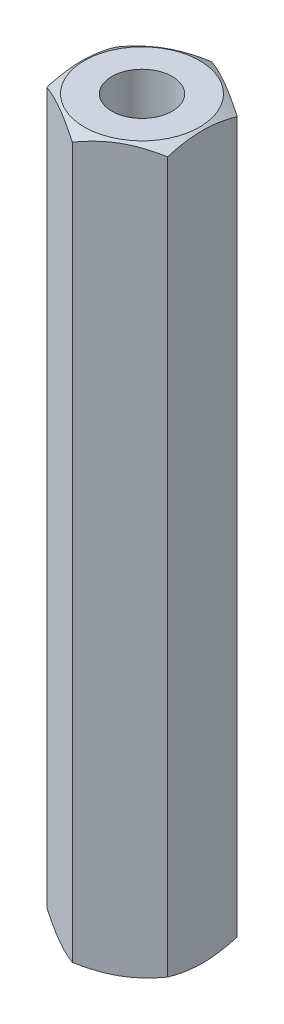
ISO-10303-21;
HEADER;
FILE_DESCRIPTION(('STEP AP214'),'2;1');
FILE_NAME('part.step','',(''),(''),'','','');
FILE_SCHEMA(('AUTOMOTIVE_DESIGN { 1 0 10303 214 1 1 1 1 }'));
ENDSEC;
DATA;
#1=APPLICATION_CONTEXT('core data for automotive mechanical design processes');
#2=APPLICATION_PROTOCOL_DEFINITION('international standard','automotive_design',2000,#1);
#3=PRODUCT_CONTEXT('',#1,'mechanical');
#4=PRODUCT('Part','Part','',(#3));
#5=PRODUCT_RELATED_PRODUCT_CATEGORY('part','',(#4));
#6=PRODUCT_DEFINITION_FORMATION('','',#4);
#7=PRODUCT_DEFINITION_CONTEXT('part definition',#1,'design');
#8=PRODUCT_DEFINITION('design','',#6,#7);
#9=PRODUCT_DEFINITION_SHAPE('','',#8);
#10=(LENGTH_UNIT() NAMED_UNIT(*) SI_UNIT(.MILLI.,.METRE.));
#11=(NAMED_UNIT(*) PLANE_ANGLE_UNIT() SI_UNIT($,.RADIAN.));
#12=(NAMED_UNIT(*) SI_UNIT($,.STERADIAN.) SOLID_ANGLE_UNIT());
#13=UNCERTAINTY_MEASURE_WITH_UNIT(LENGTH_MEASURE(1.E-05),#10,'distance_accuracy_value','');
#14=(GEOMETRIC_REPRESENTATION_CONTEXT(3) GLOBAL_UNCERTAINTY_ASSIGNED_CONTEXT((#13)) GLOBAL_UNIT_ASSIGNED_CONTEXT((#10,
#11,#12)) REPRESENTATION_CONTEXT('',''));
#15=CARTESIAN_POINT('',(0.,0.,0.));
#16=DIRECTION('',(0.,0.,1.));
#17=DIRECTION('',(1.,0.,0.));
#18=AXIS2_PLACEMENT_3D('',#15,#16,#17);
#19=CARTESIAN_POINT('',(2.5,30.,-1.44337567297406));
#20=DIRECTION('',(-0.500000000000001,0.,0.866025403784438));
#21=DIRECTION('',(0.866025403784438,0.,0.500000000000001));
#22=AXIS2_PLACEMENT_3D('',#19,#20,#21);
#23=PLANE('',#22);
#24=DIRECTION('',(0.,-1.,0.));
#25=VECTOR('',#24,1.);
#26=CARTESIAN_POINT('',(2.5,30.,-1.44337567297406));
#27=LINE('',#26,#25);
#28=CARTESIAN_POINT('',(2.5,29.7113248654054,-1.44337567297443));
#29=VERTEX_POINT('',#28);
#30=CARTESIAN_POINT('',(2.5,0.288675134594814,-1.44337567297406));
#31=VERTEX_POINT('',#30);
#32=EDGE_CURVE('E109',#29,#31,#27,.T.);
#33=ORIENTED_EDGE('',*,*,#32,.T.);
#34=CARTESIAN_POINT('',(2.5002,0.288741805261321,-1.44326020292022));
#35=CARTESIAN_POINT('',(2.39033676526513,0.252105761009838,-1.50668977106844));
#36=CARTESIAN_POINT('',(2.27952520010348,0.218786359867268,-1.57066685804385));
#37=CARTESIAN_POINT('',(2.05598316653395,0.160626426460069,-1.69972891130041));
#38=CARTESIAN_POINT('',(1.94324872547161,0.135806470049949,-1.76481617119469));
#39=CARTESIAN_POINT('',(1.71917700612473,0.0971697923432615,-1.8941840386774));
#40=CARTESIAN_POINT('',(1.60787420823263,0.0830959370878483,-1.95844473900196));
#41=CARTESIAN_POINT('',(1.38474477253167,0.0662932932549594,-2.08726857876804));
#42=CARTESIAN_POINT('',(1.27291894598578,0.0635505921058358,-2.15183124982666));
#43=CARTESIAN_POINT('',(1.06395802444848,0.0692499009102628,-2.27247489412633));
#44=CARTESIAN_POINT('',(0.96679168244227,0.076292535284071,-2.32857390783979));
#45=CARTESIAN_POINT('',(0.773092050288998,0.0986155600271525,-2.44040644260542));
#46=CARTESIAN_POINT('',(0.676559430340268,0.113903579342478,-2.49613957671839));
#47=CARTESIAN_POINT('',(0.482460278259523,0.152123234746632,-2.60820277442169));
#48=CARTESIAN_POINT('',(0.384918318217858,0.175216917027729,-2.66451865130903));
#49=CARTESIAN_POINT('',(0.191289391923913,0.227630797480126,-2.77631036402774));
#50=CARTESIAN_POINT('',(0.0951999441138212,0.256938676526762,-2.83178763258718));
#51=CARTESIAN_POINT('',(-0.000200000000003351,0.288741805261323,-2.88686681600197));
#52=B_SPLINE_CURVE_WITH_KNOTS('',3,(#34,#35,#36,#37,#38,#39,#40,#41,#42,#43,#44,#45,#46,#47,#48,
#49,#50,#51),.UNSPECIFIED.,.F.,.F.,(4,2,2,2,2,2,2,2,4),(0.,0.396285827362227,0.793524330152052,
1.18093086852114,1.56786160134476,1.90479741793733,2.24204551660463,2.58677531536757,
2.93082800105257),.UNSPECIFIED.);
#53=CARTESIAN_POINT('',(0.,0.288675134594816,-2.88675134594813));
#54=VERTEX_POINT('',#53);
#55=EDGE_CURVE('E53',#31,#54,#52,.T.);
#56=ORIENTED_EDGE('',*,*,#55,.T.);
#57=DIRECTION('',(0.,-1.,0.));
#58=VECTOR('',#57,1.);
#59=CARTESIAN_POINT('',(0.,30.,-2.88675134594813));
#60=LINE('',#59,#58);
#61=CARTESIAN_POINT('',(0.,29.7113248654052,-2.88675134594813));
#62=VERTEX_POINT('',#61);
#63=EDGE_CURVE('E11',#62,#54,#60,.T.);
#64=ORIENTED_EDGE('',*,*,#63,.F.);
#65=CARTESIAN_POINT('',(-0.000200000000003254,29.7112581947387,-2.88686681600197));
#66=CARTESIAN_POINT('',(0.109663234734867,29.7478942389902,-2.82343724785375));
#67=CARTESIAN_POINT('',(0.220474799896522,29.7812136401327,-2.75946016087834));
#68=CARTESIAN_POINT('',(0.444016833466046,29.8393735735399,-2.63039810762178));
#69=CARTESIAN_POINT('',(0.556751274528386,29.8641935299501,-2.5653108477275));
#70=CARTESIAN_POINT('',(0.780822993875267,29.9028302076567,-2.43594298024479));
#71=CARTESIAN_POINT('',(0.892125791767375,29.9169040629122,-2.37168227992023));
#72=CARTESIAN_POINT('',(1.11525522746833,29.933706706745,-2.24285844015415));
#73=CARTESIAN_POINT('',(1.22708105401423,29.9364494078942,-2.17829576909552));
#74=CARTESIAN_POINT('',(1.43604197555152,29.9307500990897,-2.05765212479585));
#75=CARTESIAN_POINT('',(1.53320831755773,29.9237074647159,-2.0015531110824));
#76=CARTESIAN_POINT('',(1.726907949711,29.9013844399728,-1.88972057631677));
#77=CARTESIAN_POINT('',(1.82344056965973,29.8860964206575,-1.83398744220379));
#78=CARTESIAN_POINT('',(2.01753972174048,29.8478767652534,-1.7219242445005));
#79=CARTESIAN_POINT('',(2.11508168178214,29.8247830829723,-1.66560836761316));
#80=CARTESIAN_POINT('',(2.30871060807609,29.7723692025199,-1.55381665489445));
#81=CARTESIAN_POINT('',(2.40480005588618,29.7430613234732,-1.49833938633501));
#82=CARTESIAN_POINT('',(2.5002,29.7112581947387,-1.44326020292022));
#83=B_SPLINE_CURVE_WITH_KNOTS('',3,(#65,#66,#67,#68,#69,#70,#71,#72,#73,#74,#75,#76,#77,#78,#79,
#80,#81,#82),.UNSPECIFIED.,.F.,.F.,(4,2,2,2,2,2,2,2,4),(0.,0.396285827362227,0.793524330152054,
1.18093086852114,1.56786160134476,1.90479741793734,2.24204551660464,2.58677531536757,
2.93082800105258),.UNSPECIFIED.);
#84=EDGE_CURVE('E211',#62,#29,#83,.T.);
#85=ORIENTED_EDGE('',*,*,#84,.T.);
#86=EDGE_LOOP('',(#33,#56,#64,#85));
#87=FACE_BOUND('',#86,.T.);
#88=ADVANCED_FACE('F36',(#87),#23,.F.);
#89=CARTESIAN_POINT('',(0.,30.,-2.88675134594813));
#90=DIRECTION('',(0.5,0.,0.866025403784438));
#91=DIRECTION('',(0.866025403784439,0.,-0.5));
#92=AXIS2_PLACEMENT_3D('',#89,#90,#91);
#93=PLANE('',#92);
#94=ORIENTED_EDGE('',*,*,#63,.T.);
#95=CARTESIAN_POINT('',(0.000199999999996824,0.288741805261323,-2.88686681600197));
#96=CARTESIAN_POINT('',(-0.109663234734875,0.25210576100984,-2.82343724785375));
#97=CARTESIAN_POINT('',(-0.220474799896529,0.21878635986727,-2.75946016087834));
#98=CARTESIAN_POINT('',(-0.444016833466054,0.160626426460071,-2.63039810762178));
#99=CARTESIAN_POINT('',(-0.556751274528393,0.135806470049951,-2.5653108477275));
#100=CARTESIAN_POINT('',(-0.780822993875274,0.0971697923432641,-2.43594298024479));
#101=CARTESIAN_POINT('',(-0.892125791767383,0.0830959370878512,-2.37168227992023));
#102=CARTESIAN_POINT('',(-1.11525522746834,0.0662932932549624,-2.24285844015415));
#103=CARTESIAN_POINT('',(-1.22708105401423,0.0635505921058387,-2.17829576909553));
#104=CARTESIAN_POINT('',(-1.43604197555153,0.0692499009102658,-2.05765212479586));
#105=CARTESIAN_POINT('',(-1.53320831755774,0.0762925352840742,-2.0015531110824));
#106=CARTESIAN_POINT('',(-1.72690794971101,0.0986155600271554,-1.88972057631678));
#107=CARTESIAN_POINT('',(-1.82344056965974,0.11390357934248,-1.8339874422038));
#108=CARTESIAN_POINT('',(-2.01753972174048,0.152123234746634,-1.7219242445005));
#109=CARTESIAN_POINT('',(-2.11508168178214,0.17521691702773,-1.66560836761317));
#110=CARTESIAN_POINT('',(-2.30871060807609,0.227630797480127,-1.55381665489446));
#111=CARTESIAN_POINT('',(-2.40480005588618,0.256938676526762,-1.49833938633502));
#112=CARTESIAN_POINT('',(-2.5002,0.288741805261322,-1.44326020292023));
#113=B_SPLINE_CURVE_WITH_KNOTS('',3,(#95,#96,#97,#98,#99,#100,#101,#102,#103,#104,#105,#106,
#107,#108,#109,#110,#111,#112),.UNSPECIFIED.,.F.,.F.,(4,2,2,2,2,2,2,2,4),(0.,0.396285827362228,
0.793524330152054,1.18093086852114,1.56786160134476,1.90479741793733,2.24204551660463,
2.58677531536756,2.93082800105256),.UNSPECIFIED.);
#114=CARTESIAN_POINT('',(-2.5,0.288675134594564,-1.44337567297444));
#115=VERTEX_POINT('',#114);
#116=EDGE_CURVE('E125',#54,#115,#113,.T.);
#117=ORIENTED_EDGE('',*,*,#116,.T.);
#118=DIRECTION('',(0.,-1.,0.));
#119=VECTOR('',#118,1.);
#120=CARTESIAN_POINT('',(-2.5,30.,-1.44337567297407));
#121=LINE('',#120,#119);
#122=CARTESIAN_POINT('',(-2.5,29.7113248654054,-1.44337567297444));
#123=VERTEX_POINT('',#122);
#124=EDGE_CURVE('E45',#123,#115,#121,.T.);
#125=ORIENTED_EDGE('',*,*,#124,.F.);
#126=CARTESIAN_POINT('',(-2.5002,29.7112581947387,-1.44326020292023));
#127=CARTESIAN_POINT('',(-2.39033676526513,29.7478942389902,-1.50668977106845));
#128=CARTESIAN_POINT('',(-2.27952520010347,29.7812136401327,-1.57066685804386));
#129=CARTESIAN_POINT('',(-2.05598316653395,29.8393735735399,-1.69972891130042));
#130=CARTESIAN_POINT('',(-1.94324872547161,29.8641935299501,-1.7648161711947));
#131=CARTESIAN_POINT('',(-1.71917700612473,29.9028302076567,-1.89418403867741));
#132=CARTESIAN_POINT('',(-1.60787420823262,29.9169040629121,-1.95844473900197));
#133=CARTESIAN_POINT('',(-1.38474477253166,29.933706706745,-2.08726857876805));
#134=CARTESIAN_POINT('',(-1.27291894598577,29.9364494078942,-2.15183124982667));
#135=CARTESIAN_POINT('',(-1.06395802444848,29.9307500990897,-2.27247489412634));
#136=CARTESIAN_POINT('',(-0.966791682442266,29.9237074647159,-2.3285739078398));
#137=CARTESIAN_POINT('',(-0.773092050288995,29.9013844399728,-2.44040644260542));
#138=CARTESIAN_POINT('',(-0.676559430340266,29.8860964206575,-2.4961395767184));
#139=CARTESIAN_POINT('',(-0.482460278259523,29.8478767652534,-2.6082027744217));
#140=CARTESIAN_POINT('',(-0.384918318217859,29.8247830829723,-2.66451865130903));
#141=CARTESIAN_POINT('',(-0.191289391923916,29.7723692025199,-2.77631036402774));
#142=CARTESIAN_POINT('',(-0.0951999441138265,29.7430613234732,-2.83178763258718));
#143=CARTESIAN_POINT('',(0.000199999999996853,29.7112581947387,-2.88686681600197));
#144=B_SPLINE_CURVE_WITH_KNOTS('',3,(#126,#127,#128,#129,#130,#131,#132,#133,#134,#135,#136,
#137,#138,#139,#140,#141,#142,#143),.UNSPECIFIED.,.F.,.F.,(4,2,2,2,2,2,2,2,4),(0.,
0.396285827362228,0.793524330152053,1.18093086852114,1.56786160134476,1.90479741793733,
2.24204551660463,2.58677531536756,2.93082800105256),.UNSPECIFIED.);
#145=EDGE_CURVE('E199',#123,#62,#144,.T.);
#146=ORIENTED_EDGE('',*,*,#145,.T.);
#147=EDGE_LOOP('',(#94,#117,#125,#146));
#148=FACE_BOUND('',#147,.T.);
#149=ADVANCED_FACE('F185',(#148),#93,.F.);
#150=CARTESIAN_POINT('',(-2.5,30.,-1.44337567297407));
#151=DIRECTION('',(1.,0.,0.));
#152=DIRECTION('',(0.,0.,-1.));
#153=AXIS2_PLACEMENT_3D('',#150,#151,#152);
#154=PLANE('',#153);
#155=ORIENTED_EDGE('',*,*,#124,.T.);
#156=CARTESIAN_POINT('',(-2.5,1.28663298822599,-3.8795194937669));
#157=CARTESIAN_POINT('',(-2.5,1.2336451613314,-3.7703066153545));
#158=CARTESIAN_POINT('',(-2.5,1.18116470176831,-3.66084329012373));
#159=CARTESIAN_POINT('',(-2.5,1.07750382370916,-3.44128256896489));
#160=CARTESIAN_POINT('',(-2.5,1.02632360962839,-3.33118507663453));
#161=CARTESIAN_POINT('',(-2.5,0.925291572765471,-3.10965677499139));
#162=CARTESIAN_POINT('',(-2.5,0.875448477413951,-2.99822197160029));
#163=CARTESIAN_POINT('',(-2.5,0.777798803442547,-2.77446689113107));
#164=CARTESIAN_POINT('',(-2.5,0.729992128763003,-2.66214665611635));
#165=CARTESIAN_POINT('',(-2.5,0.635455320843376,-2.43280919865732));
#166=CARTESIAN_POINT('',(-2.5,0.588809295603019,-2.31575711540437));
#167=CARTESIAN_POINT('',(-2.5,0.499041706085415,-2.08028439689837));
#168=CARTESIAN_POINT('',(-2.5,0.455920537015878,-1.96186360988023));
#169=CARTESIAN_POINT('',(-2.5,0.374332850782189,-1.7236859699711));
#170=CARTESIAN_POINT('',(-2.5,0.335856932872012,-1.60393236993135));
#171=CARTESIAN_POINT('',(-2.5,0.264792794000087,-1.3627073261545));
#172=CARTESIAN_POINT('',(-2.5,0.232202721245984,-1.24123643572216));
#173=CARTESIAN_POINT('',(-2.5,0.1746460377822,-0.997181753031132));
#174=CARTESIAN_POINT('',(-2.5,0.149638061201947,-0.874607899164098));
#175=CARTESIAN_POINT('',(-2.5,0.108657662490944,-0.627933229715273));
#176=CARTESIAN_POINT('',(-2.5,0.092684378036338,-0.503832561017258));
#177=CARTESIAN_POINT('',(-2.5,0.0712565841938792,-0.256346394124497));
#178=CARTESIAN_POINT('',(-2.5,0.0656666533647721,-0.132972916353094));
#179=CARTESIAN_POINT('',(-2.5,0.0651228342557952,0.113807936016704));
#180=CARTESIAN_POINT('',(-2.5,0.0701691503049076,0.237215311220755));
#181=CARTESIAN_POINT('',(-2.5,0.0874019231426418,0.446647497087662));
#182=CARTESIAN_POINT('',(-2.5,0.0970246096330575,0.532896307155603));
#183=CARTESIAN_POINT('',(-2.5,0.120867375974025,0.704762140815135));
#184=CARTESIAN_POINT('',(-2.5,0.135088078666098,0.790379077205929));
#185=CARTESIAN_POINT('',(-2.5,0.183901923588519,1.0461567886821));
#186=CARTESIAN_POINT('',(-2.5,0.224637891382638,1.21514880809651));
#187=CARTESIAN_POINT('',(-2.5,0.319113369972292,1.55338059480216));
#188=CARTESIAN_POINT('',(-2.5,0.37312203901306,1.72254221530021));
#189=CARTESIAN_POINT('',(-2.5,0.460667322987574,1.97393605383535));
#190=CARTESIAN_POINT('',(-2.5,0.490934375387349,2.05733417600479));
#191=CARTESIAN_POINT('',(-2.5,0.553303541324916,2.22344128061506));
#192=CARTESIAN_POINT('',(-2.5,0.585405632373324,2.30615027148735));
#193=CARTESIAN_POINT('',(-2.5,0.663837431864511,2.50280429754373));
#194=CARTESIAN_POINT('',(-2.5,0.710870961348789,2.61646782638037));
#195=CARTESIAN_POINT('',(-2.5,0.807245098078847,2.84281508916496));
#196=CARTESIAN_POINT('',(-2.5,0.856585843514103,2.95549876394446));
#197=CARTESIAN_POINT('',(-2.5,1.00734411005895,3.29237771327765));
#198=CARTESIAN_POINT('',(-2.5,1.11147891468007,3.51535511566758));
#199=CARTESIAN_POINT('',(-2.5,1.32452351634581,3.95927797948236));
#200=CARTESIAN_POINT('',(-2.5,1.43343819052228,4.18022107349342));
#201=CARTESIAN_POINT('',(-2.5,1.65446087983403,4.62051044201428));
#202=CARTESIAN_POINT('',(-2.5,1.76656901359029,4.83985665682707));
#203=CARTESIAN_POINT('',(-2.5,1.98338345778777,5.25874057243927));
#204=CARTESIAN_POINT('',(-2.5,2.08790645695578,5.45837349168487));
#205=CARTESIAN_POINT('',(-2.5,2.29836608480818,5.85690137993564));
#206=CARTESIAN_POINT('',(-2.5,2.40430276531333,6.05579632154561));
#207=CARTESIAN_POINT('',(-2.5,2.61698040136049,6.45250532295108));
#208=CARTESIAN_POINT('',(-2.5,2.72371863370807,6.65032084483054));
#209=CARTESIAN_POINT('',(-2.5,2.93803723647982,7.0454809321075));
#210=CARTESIAN_POINT('',(-2.5,3.04561755908196,7.24282552343029));
#211=CARTESIAN_POINT('',(-2.5,3.15351152056542,7.43999729490421));
#212=B_SPLINE_CURVE_WITH_KNOTS('',3,(#156,#157,#158,#159,#160,#161,#162,#163,#164,#165,#166,
#167,#168,#169,#170,#171,#172,#173,#174,#175,#176,#177,#178,#179,#180,#181,#182,#183,#184,#185,
#186,#187,#188,#189,#190,#191,#192,#193,#194,#195,#196,#197,#198,#199,#200,#201,#202,#203,#204,
#205,#206,#207,#208,#209,#210,#211),.UNSPECIFIED.,.F.,.F.,(4,2,2,2,2,2,2,2,2,2,2,2,2,2,2,2,2,2,
2,2,2,2,2,2,2,2,2,4),(0.,0.364169872728521,0.728396647721358,1.09460218353756,1.46079042596113,
1.83875895371293,2.21676980142478,2.59400235611465,2.97111601914061,3.34613361066182,
3.72111540226805,4.09117131892071,4.46123434464473,4.72146100911328,4.98172293833835,
5.5025336700924,6.03493226673469,6.30107724404247,6.56721896029977,6.93621616596536,
7.30523550090225,8.04342254549127,8.78238115470069,9.52136724839593,10.1973823060177,
10.8734222125038,11.547746551772,12.2220328702793),.UNSPECIFIED.);
#213=CARTESIAN_POINT('',(-2.5,0.288675134594815,1.44337567297407));
#214=VERTEX_POINT('',#213);
#215=EDGE_CURVE('E130',#115,#214,#212,.T.);
#216=ORIENTED_EDGE('',*,*,#215,.T.);
#217=DIRECTION('',(0.,-1.,0.));
#218=VECTOR('',#217,1.);
#219=CARTESIAN_POINT('',(-2.5,30.,1.44337567297407));
#220=LINE('',#219,#218);
#221=CARTESIAN_POINT('',(-2.5,29.7113248654052,1.44337567297407));
#222=VERTEX_POINT('',#221);
#223=EDGE_CURVE('E111',#222,#214,#220,.T.);
#224=ORIENTED_EDGE('',*,*,#223,.F.);
#225=CARTESIAN_POINT('',(-2.5,28.713367011774,-3.8795194937669));
#226=CARTESIAN_POINT('',(-2.5,28.7663548386686,-3.77030661535451));
#227=CARTESIAN_POINT('',(-2.5,28.8188352982317,-3.66084329012374));
#228=CARTESIAN_POINT('',(-2.5,28.9224961762908,-3.44128256896489));
#229=CARTESIAN_POINT('',(-2.5,28.9736763903716,-3.33118507663453));
#230=CARTESIAN_POINT('',(-2.5,29.0747084272345,-3.1096567749914));
#231=CARTESIAN_POINT('',(-2.5,29.124551522586,-2.99822197160029));
#232=CARTESIAN_POINT('',(-2.5,29.2222011965574,-2.77446689113108));
#233=CARTESIAN_POINT('',(-2.5,29.270007871237,-2.66214665611636));
#234=CARTESIAN_POINT('',(-2.5,29.3645446791566,-2.43280919865732));
#235=CARTESIAN_POINT('',(-2.5,29.411190704397,-2.31575711540438));
#236=CARTESIAN_POINT('',(-2.5,29.5009582939146,-2.08028439689837));
#237=CARTESIAN_POINT('',(-2.5,29.5440794629841,-1.96186360988023));
#238=CARTESIAN_POINT('',(-2.5,29.6256671492178,-1.7236859699711));
#239=CARTESIAN_POINT('',(-2.5,29.664143067128,-1.60393236993135));
#240=CARTESIAN_POINT('',(-2.5,29.7352072059999,-1.3627073261545));
#241=CARTESIAN_POINT('',(-2.5,29.767797278754,-1.24123643572216));
#242=CARTESIAN_POINT('',(-2.5,29.8253539622178,-0.997181753031132));
#243=CARTESIAN_POINT('',(-2.5,29.8503619387981,-0.874607899164098));
#244=CARTESIAN_POINT('',(-2.5,29.8913423375091,-0.627933229715274));
#245=CARTESIAN_POINT('',(-2.5,29.9073156219637,-0.503832561017258));
#246=CARTESIAN_POINT('',(-2.5,29.9287434158061,-0.256346394124496));
#247=CARTESIAN_POINT('',(-2.5,29.9343333466352,-0.132972916353094));
#248=CARTESIAN_POINT('',(-2.5,29.9348771657442,0.113807936016705));
#249=CARTESIAN_POINT('',(-2.5,29.9298308496951,0.237215311220755));
#250=CARTESIAN_POINT('',(-2.5,29.9125980768574,0.446647497087662));
#251=CARTESIAN_POINT('',(-2.5,29.9029753903669,0.532896307155603));
#252=CARTESIAN_POINT('',(-2.5,29.879132624026,0.704762140815135));
#253=CARTESIAN_POINT('',(-2.5,29.8649119213339,0.790379077205929));
#254=CARTESIAN_POINT('',(-2.5,29.8160980764115,1.0461567886821));
#255=CARTESIAN_POINT('',(-2.5,29.7753621086174,1.21514880809651));
#256=CARTESIAN_POINT('',(-2.5,29.6808866300277,1.55338059480216));
#257=CARTESIAN_POINT('',(-2.5,29.6268779609869,1.72254221530021));
#258=CARTESIAN_POINT('',(-2.5,29.5393326770124,1.97393605383535));
#259=CARTESIAN_POINT('',(-2.5,29.5090656246127,2.05733417600478));
#260=CARTESIAN_POINT('',(-2.5,29.4466964586751,2.22344128061506));
#261=CARTESIAN_POINT('',(-2.5,29.4145943676267,2.30615027148735));
#262=CARTESIAN_POINT('',(-2.5,29.3361625681355,2.50280429754373));
#263=CARTESIAN_POINT('',(-2.5,29.2891290386512,2.61646782638037));
#264=CARTESIAN_POINT('',(-2.5,29.1927549019212,2.84281508916496));
#265=CARTESIAN_POINT('',(-2.5,29.1434141564859,2.95549876394446));
#266=CARTESIAN_POINT('',(-2.5,28.9926558899411,3.29237771327765));
#267=CARTESIAN_POINT('',(-2.5,28.8885210853199,3.51535511566758));
#268=CARTESIAN_POINT('',(-2.5,28.6754764836542,3.95927797948236));
#269=CARTESIAN_POINT('',(-2.5,28.5665618094777,4.18022107349342));
#270=CARTESIAN_POINT('',(-2.5,28.345539120166,4.62051044201428));
#271=CARTESIAN_POINT('',(-2.5,28.2334309864097,4.83985665682707));
#272=CARTESIAN_POINT('',(-2.5,28.0166165422122,5.25874057243927));
#273=CARTESIAN_POINT('',(-2.5,27.9120935430442,5.45837349168487));
#274=CARTESIAN_POINT('',(-2.5,27.7016339151918,5.85690137993564));
#275=CARTESIAN_POINT('',(-2.5,27.5956972346867,6.05579632154561));
#276=CARTESIAN_POINT('',(-2.5,27.3830195986395,6.45250532295108));
#277=CARTESIAN_POINT('',(-2.5,27.2762813662919,6.65032084483054));
#278=CARTESIAN_POINT('',(-2.5,27.0619627635202,7.0454809321075));
#279=CARTESIAN_POINT('',(-2.5,26.954382440918,7.24282552343029));
#280=CARTESIAN_POINT('',(-2.5,26.8464884794346,7.43999729490421));
#281=B_SPLINE_CURVE_WITH_KNOTS('',3,(#225,#226,#227,#228,#229,#230,#231,#232,#233,#234,#235,
#236,#237,#238,#239,#240,#241,#242,#243,#244,#245,#246,#247,#248,#249,#250,#251,#252,#253,#254,
#255,#256,#257,#258,#259,#260,#261,#262,#263,#264,#265,#266,#267,#268,#269,#270,#271,#272,#273,
#274,#275,#276,#277,#278,#279,#280),.UNSPECIFIED.,.F.,.F.,(4,2,2,2,2,2,2,2,2,2,2,2,2,2,2,2,2,2,
2,2,2,2,2,2,2,2,2,4),(0.,0.36416987272852,0.728396647721358,1.09460218353756,1.46079042596113,
1.83875895371293,2.21676980142478,2.59400235611465,2.97111601914062,3.34613361066183,
3.72111540226805,4.09117131892072,4.46123434464473,4.72146100911329,4.98172293833835,
5.50253367009241,6.03493226673469,6.30107724404247,6.56721896029978,6.93621616596536,
7.30523550090225,8.04342254549128,8.78238115470069,9.52136724839594,10.1973823060177,
10.8734222125038,11.547746551772,12.2220328702793),.UNSPECIFIED.);
#282=EDGE_CURVE('E191',#222,#123,#281,.F.);
#283=ORIENTED_EDGE('',*,*,#282,.T.);
#284=EDGE_LOOP('',(#155,#216,#224,#283));
#285=FACE_BOUND('',#284,.T.);
#286=ADVANCED_FACE('F181',(#285),#154,.F.);
#287=CARTESIAN_POINT('',(-2.5,30.,1.44337567297407));
#288=DIRECTION('',(0.5,0.,-0.866025403784439));
#289=DIRECTION('',(-0.866025403784439,0.,-0.5));
#290=AXIS2_PLACEMENT_3D('',#287,#288,#289);
#291=PLANE('',#290);
#292=ORIENTED_EDGE('',*,*,#223,.T.);
#293=CARTESIAN_POINT('',(-2.5002,0.288741805261321,1.44326020292023));
#294=CARTESIAN_POINT('',(-2.39033676526513,0.252105761009838,1.50668977106845));
#295=CARTESIAN_POINT('',(-2.27952520010347,0.218786359867268,1.57066685804385));
#296=CARTESIAN_POINT('',(-2.05598316653395,0.160626426460069,1.69972891130042));
#297=CARTESIAN_POINT('',(-1.94324872547161,0.135806470049949,1.7648161711947));
#298=CARTESIAN_POINT('',(-1.71917700612473,0.0971697923432624,1.8941840386774));
#299=CARTESIAN_POINT('',(-1.60787420823262,0.0830959370878492,1.95844473900197));
#300=CARTESIAN_POINT('',(-1.38474477253166,0.0662932932549604,2.08726857876805));
#301=CARTESIAN_POINT('',(-1.27291894598577,0.0635505921058368,2.15183124982667));
#302=CARTESIAN_POINT('',(-1.06395802444848,0.069249900910264,2.27247489412634));
#303=CARTESIAN_POINT('',(-0.966791682442264,0.0762925352840724,2.3285739078398));
#304=CARTESIAN_POINT('',(-0.773092050288991,0.0986155600271541,2.44040644260542));
#305=CARTESIAN_POINT('',(-0.676559430340261,0.113903579342479,2.4961395767184));
#306=CARTESIAN_POINT('',(-0.482460278259516,0.152123234746634,2.6082027744217));
#307=CARTESIAN_POINT('',(-0.384918318217851,0.175216917027731,2.66451865130903));
#308=CARTESIAN_POINT('',(-0.191289391923905,0.227630797480128,2.77631036402774));
#309=CARTESIAN_POINT('',(-0.0951999441138134,0.256938676526764,2.83178763258718));
#310=CARTESIAN_POINT('',(0.000200000000011148,0.288741805261325,2.88686681600197));
#311=B_SPLINE_CURVE_WITH_KNOTS('',3,(#293,#294,#295,#296,#297,#298,#299,#300,#301,#302,#303,
#304,#305,#306,#307,#308,#309,#310),.UNSPECIFIED.,.F.,.F.,(4,2,2,2,2,2,2,2,4),(0.,
0.396285827362228,0.793524330152053,1.18093086852114,1.56786160134476,1.90479741793734,
2.24204551660464,2.58677531536757,2.93082800105258),.UNSPECIFIED.);
#312=CARTESIAN_POINT('',(0.,0.288675134594818,2.88675134594813));
#313=VERTEX_POINT('',#312);
#314=EDGE_CURVE('E105',#214,#313,#311,.T.);
#315=ORIENTED_EDGE('',*,*,#314,.T.);
#316=DIRECTION('',(0.,-1.,0.));
#317=VECTOR('',#316,1.);
#318=CARTESIAN_POINT('',(0.,30.,2.88675134594813));
#319=LINE('',#318,#317);
#320=CARTESIAN_POINT('',(0.,29.7113248654052,2.88675134594813));
#321=VERTEX_POINT('',#320);
#322=EDGE_CURVE('E104',#321,#313,#319,.T.);
#323=ORIENTED_EDGE('',*,*,#322,.F.);
#324=CARTESIAN_POINT('',(0.000200000000010416,29.7112581947387,2.88686681600197));
#325=CARTESIAN_POINT('',(-0.109663234734861,29.7478942389902,2.82343724785375));
#326=CARTESIAN_POINT('',(-0.220474799896516,29.7812136401327,2.75946016087835));
#327=CARTESIAN_POINT('',(-0.444016833466041,29.8393735735399,2.63039810762179));
#328=CARTESIAN_POINT('',(-0.556751274528379,29.8641935299501,2.5653108477275));
#329=CARTESIAN_POINT('',(-0.78082299387526,29.9028302076567,2.4359429802448));
#330=CARTESIAN_POINT('',(-0.892125791767368,29.9169040629121,2.37168227992023));
#331=CARTESIAN_POINT('',(-1.11525522746833,29.933706706745,2.24285844015415));
#332=CARTESIAN_POINT('',(-1.22708105401422,29.9364494078942,2.17829576909553));
#333=CARTESIAN_POINT('',(-1.43604197555151,29.9307500990897,2.05765212479586));
#334=CARTESIAN_POINT('',(-1.53320831755772,29.9237074647159,2.0015531110824));
#335=CARTESIAN_POINT('',(-1.726907949711,29.9013844399728,1.88972057631678));
#336=CARTESIAN_POINT('',(-1.82344056965973,29.8860964206575,1.8339874422038));
#337=CARTESIAN_POINT('',(-2.01753972174047,29.8478767652534,1.7219242445005));
#338=CARTESIAN_POINT('',(-2.11508168178214,29.8247830829723,1.66560836761317));
#339=CARTESIAN_POINT('',(-2.30871060807608,29.7723692025199,1.55381665489446));
#340=CARTESIAN_POINT('',(-2.40480005588617,29.7430613234732,1.49833938633502));
#341=CARTESIAN_POINT('',(-2.5002,29.7112581947387,1.44326020292023));
#342=B_SPLINE_CURVE_WITH_KNOTS('',3,(#324,#325,#326,#327,#328,#329,#330,#331,#332,#333,#334,
#335,#336,#337,#338,#339,#340,#341),.UNSPECIFIED.,.F.,.F.,(4,2,2,2,2,2,2,2,4),(0.,
0.396285827362229,0.793524330152053,1.18093086852114,1.56786160134476,1.90479741793734,
2.24204551660464,2.58677531536757,2.93082800105258),.UNSPECIFIED.);
#343=EDGE_CURVE('E200',#321,#222,#342,.T.);
#344=ORIENTED_EDGE('',*,*,#343,.T.);
#345=EDGE_LOOP('',(#292,#315,#323,#344));
#346=FACE_BOUND('',#345,.T.);
#347=ADVANCED_FACE('F184',(#346),#291,.F.);
#348=CARTESIAN_POINT('',(0.,30.,2.88675134594813));
#349=DIRECTION('',(-0.500000000000001,0.,-0.866025403784438));
#350=DIRECTION('',(-0.866025403784438,0.,0.500000000000001));
#351=AXIS2_PLACEMENT_3D('',#348,#349,#350);
#352=PLANE('',#351);
#353=ORIENTED_EDGE('',*,*,#322,.T.);
#354=CARTESIAN_POINT('',(-0.000199999999989636,0.288741805261325,2.88686681600197));
#355=CARTESIAN_POINT('',(0.109663234734882,0.252105761009842,2.82343724785375));
#356=CARTESIAN_POINT('',(0.220474799896537,0.218786359867272,2.75946016087835));
#357=CARTESIAN_POINT('',(0.444016833466062,0.160626426460073,2.63039810762178));
#358=CARTESIAN_POINT('',(0.556751274528401,0.135806470049953,2.5653108477275));
#359=CARTESIAN_POINT('',(0.780822993875282,0.0971697923432669,2.4359429802448));
#360=CARTESIAN_POINT('',(0.89212579176739,0.083095937087854,2.37168227992023));
#361=CARTESIAN_POINT('',(1.11525522746835,0.0662932932549656,2.24285844015415));
#362=CARTESIAN_POINT('',(1.22708105401424,0.0635505921058423,2.17829576909553));
#363=CARTESIAN_POINT('',(1.43604197555153,0.0692499009102697,2.05765212479586));
#364=CARTESIAN_POINT('',(1.53320831755774,0.076292535284078,2.0015531110824));
#365=CARTESIAN_POINT('',(1.72690794971101,0.0986155600271592,1.88972057631678));
#366=CARTESIAN_POINT('',(1.82344056965974,0.113903579342484,1.8339874422038));
#367=CARTESIAN_POINT('',(2.01753972174049,0.152123234746638,1.72192424450051));
#368=CARTESIAN_POINT('',(2.11508168178215,0.175216917027734,1.66560836761317));
#369=CARTESIAN_POINT('',(2.30871060807609,0.227630797480131,1.55381665489446));
#370=CARTESIAN_POINT('',(2.40480005588618,0.256938676526766,1.49833938633502));
#371=CARTESIAN_POINT('',(2.50020000000001,0.288741805261326,1.44326020292023));
#372=B_SPLINE_CURVE_WITH_KNOTS('',3,(#354,#355,#356,#357,#358,#359,#360,#361,#362,#363,#364,
#365,#366,#367,#368,#369,#370,#371),.UNSPECIFIED.,.F.,.F.,(4,2,2,2,2,2,2,2,4),(0.,
0.396285827362228,0.793524330152054,1.18093086852114,1.56786160134476,1.90479741793733,
2.24204551660463,2.58677531536756,2.93082800105256),.UNSPECIFIED.);
#373=CARTESIAN_POINT('',(2.50000000000001,0.288675134594819,1.44337567297407));
#374=VERTEX_POINT('',#373);
#375=EDGE_CURVE('E91',#313,#374,#372,.T.);
#376=ORIENTED_EDGE('',*,*,#375,.T.);
#377=DIRECTION('',(0.,-1.,0.));
#378=VECTOR('',#377,1.);
#379=CARTESIAN_POINT('',(2.50000000000001,30.,1.44337567297407));
#380=LINE('',#379,#378);
#381=CARTESIAN_POINT('',(2.50000000000001,29.7113248654052,1.44337567297407));
#382=VERTEX_POINT('',#381);
#383=EDGE_CURVE('E102',#382,#374,#380,.T.);
#384=ORIENTED_EDGE('',*,*,#383,.F.);
#385=CARTESIAN_POINT('',(2.50020000000001,29.7112581947387,1.44326020292023));
#386=CARTESIAN_POINT('',(2.39033676526513,29.7478942389902,1.50668977106845));
#387=CARTESIAN_POINT('',(2.27952520010348,29.7812136401327,1.57066685804386));
#388=CARTESIAN_POINT('',(2.05598316653395,29.8393735735399,1.69972891130042));
#389=CARTESIAN_POINT('',(1.94324872547161,29.8641935299501,1.7648161711947));
#390=CARTESIAN_POINT('',(1.71917700612473,29.9028302076567,1.89418403867741));
#391=CARTESIAN_POINT('',(1.60787420823262,29.9169040629121,1.95844473900198));
#392=CARTESIAN_POINT('',(1.38474477253167,29.933706706745,2.08726857876805));
#393=CARTESIAN_POINT('',(1.27291894598577,29.9364494078942,2.15183124982668));
#394=CARTESIAN_POINT('',(1.06395802444848,29.9307500990897,2.27247489412635));
#395=CARTESIAN_POINT('',(0.966791682442271,29.9237074647159,2.3285739078398));
#396=CARTESIAN_POINT('',(0.773092050289001,29.9013844399728,2.44040644260543));
#397=CARTESIAN_POINT('',(0.676559430340272,29.8860964206575,2.4961395767184));
#398=CARTESIAN_POINT('',(0.482460278259531,29.8478767652534,2.6082027744217));
#399=CARTESIAN_POINT('',(0.384918318217867,29.8247830829723,2.66451865130904));
#400=CARTESIAN_POINT('',(0.191289391923924,29.7723692025199,2.77631036402774));
#401=CARTESIAN_POINT('',(0.0951999441138338,29.7430613234732,2.83178763258718));
#402=CARTESIAN_POINT('',(-0.000199999999989296,29.7112581947387,2.88686681600197));
#403=B_SPLINE_CURVE_WITH_KNOTS('',3,(#385,#386,#387,#388,#389,#390,#391,#392,#393,#394,#395,
#396,#397,#398,#399,#400,#401,#402),.UNSPECIFIED.,.F.,.F.,(4,2,2,2,2,2,2,2,4),(0.,
0.39628582736223,0.793524330152056,1.18093086852115,1.56786160134476,1.90479741793734,
2.24204551660463,2.58677531536756,2.93082800105256),.UNSPECIFIED.);
#404=EDGE_CURVE('E61',#382,#321,#403,.T.);
#405=ORIENTED_EDGE('',*,*,#404,.T.);
#406=EDGE_LOOP('',(#353,#376,#384,#405));
#407=FACE_BOUND('',#406,.T.);
#408=ADVANCED_FACE('F101',(#407),#352,.F.);
#409=CARTESIAN_POINT('',(2.50000000000001,30.,1.44337567297407));
#410=DIRECTION('',(-1.,0.,0.));
#411=DIRECTION('',(0.,0.,1.));
#412=AXIS2_PLACEMENT_3D('',#409,#410,#411);
#413=PLANE('',#412);
#414=ORIENTED_EDGE('',*,*,#383,.T.);
#415=CARTESIAN_POINT('',(2.5,1.28663298827211,-3.87951949386192));
#416=CARTESIAN_POINT('',(2.5,1.23364516137558,-3.77030661544633));
#417=CARTESIAN_POINT('',(2.5,1.18116470181057,-3.66084329021236));
#418=CARTESIAN_POINT('',(2.5,1.07750382374757,-3.44128256904712));
#419=CARTESIAN_POINT('',(2.5,1.02632360966488,-3.33118507671356));
#420=CARTESIAN_POINT('',(2.5,0.925291572798119,-3.10965677506396));
#421=CARTESIAN_POINT('',(2.5,0.875448477444679,-2.9982219716696));
#422=CARTESIAN_POINT('',(2.5,0.777798803469467,-2.77446689119385));
#423=CARTESIAN_POINT('',(2.5,0.729992128788034,-2.66214665617585));
#424=CARTESIAN_POINT('',(2.5,0.635455320864582,-2.43280919871002));
#425=CARTESIAN_POINT('',(2.5,0.588809295622294,-2.31575711545355));
#426=CARTESIAN_POINT('',(2.5,0.49904170610093,-2.08028439694044));
#427=CARTESIAN_POINT('',(2.5,0.455920537029566,-1.96186360991873));
#428=CARTESIAN_POINT('',(2.5,0.374332850792401,-1.72368597000237));
#429=CARTESIAN_POINT('',(2.5,0.335856932880573,-1.60393236995896));
#430=CARTESIAN_POINT('',(2.5,0.264792794005622,-1.36270732617472));
#431=CARTESIAN_POINT('',(2.5,0.232202721250143,-1.24123643573863));
#432=CARTESIAN_POINT('',(2.5,0.174646037783588,-0.997181753038156));
#433=CARTESIAN_POINT('',(2.5,0.149638061202051,-0.874607899165394));
#434=CARTESIAN_POINT('',(2.5,0.108657662489349,-0.62793322970498));
#435=CARTESIAN_POINT('',(2.5,0.0926843780343284,-0.503832561001103));
#436=CARTESIAN_POINT('',(2.5,0.0712565841920815,-0.256346394096717));
#437=CARTESIAN_POINT('',(2.5,0.0656666533635826,-0.132972916319554));
#438=CARTESIAN_POINT('',(2.5,0.0651228342568173,0.113807936061675));
#439=CARTESIAN_POINT('',(2.5,0.0701691503075335,0.237215311271394));
#440=CARTESIAN_POINT('',(2.5,0.0874019231484925,0.446647497145476));
#441=CARTESIAN_POINT('',(2.5,0.0970246096401927,0.532896307214986));
#442=CARTESIAN_POINT('',(2.5,0.120867375983799,0.704762140877588));
#443=CARTESIAN_POINT('',(2.5,0.135088078677225,0.790379077269884));
#444=CARTESIAN_POINT('',(2.5,0.183901923603737,1.04615678875048));
#445=CARTESIAN_POINT('',(2.50000000000001,0.224637891400621,1.21514880816772));
#446=CARTESIAN_POINT('',(2.50000000000001,0.319113369995744,1.55338059487907));
#447=CARTESIAN_POINT('',(2.50000000000001,0.373122039039216,1.72254221537998));
#448=CARTESIAN_POINT('',(2.50000000000001,0.460667323017652,1.97393605391939));
#449=CARTESIAN_POINT('',(2.50000000000001,0.490934375418711,2.05733417609025));
#450=CARTESIAN_POINT('',(2.50000000000001,0.553303541358803,2.22344128070336));
#451=CARTESIAN_POINT('',(2.50000000000001,0.585405632408452,2.30615027157706));
#452=CARTESIAN_POINT('',(2.50000000000001,0.663837431901591,2.50280429763441));
#453=CARTESIAN_POINT('',(2.50000000000001,0.710870961386499,2.61646782647063));
#454=CARTESIAN_POINT('',(2.50000000000001,0.807245098117666,2.84281508925443));
#455=CARTESIAN_POINT('',(2.50000000000001,0.856585843553401,2.95549876403355));
#456=CARTESIAN_POINT('',(2.50000000000001,1.00734411009951,3.29237771336569));
#457=CARTESIAN_POINT('',(2.50000000000001,1.11147891472126,3.51535511575499));
#458=CARTESIAN_POINT('',(2.50000000000001,1.32452351638796,3.9592779795686));
#459=CARTESIAN_POINT('',(2.50000000000001,1.43343819056478,4.18022107357912));
#460=CARTESIAN_POINT('',(2.50000000000001,1.65446087987707,4.62051044209898));
#461=CARTESIAN_POINT('',(2.50000000000001,1.76656901363352,4.83985665691129));
#462=CARTESIAN_POINT('',(2.50000000000001,1.98338345783143,5.25874057252297));
#463=CARTESIAN_POINT('',(2.50000000000001,2.0879064569997,5.45837349176851));
#464=CARTESIAN_POINT('',(2.50000000000001,2.29836608485255,5.85690138001919));
#465=CARTESIAN_POINT('',(2.50000000000001,2.40430276535791,6.05579632162912));
#466=CARTESIAN_POINT('',(2.50000000000001,2.61698040140546,6.45250532303459));
#467=CARTESIAN_POINT('',(2.50000000000001,2.72371863375323,6.6503208449141));
#468=CARTESIAN_POINT('',(2.50000000000001,2.93803723652534,7.04548093219115));
#469=CARTESIAN_POINT('',(2.50000000000001,3.04561755912765,7.24282552351399));
#470=CARTESIAN_POINT('',(2.50000000000001,3.15351152061127,7.43999729498798));
#471=B_SPLINE_CURVE_WITH_KNOTS('',3,(#415,#416,#417,#418,#419,#420,#421,#422,#423,#424,#425,
#426,#427,#428,#429,#430,#431,#432,#433,#434,#435,#436,#437,#438,#439,#440,#441,#442,#443,#444,
#445,#446,#447,#448,#449,#450,#451,#452,#453,#454,#455,#456,#457,#458,#459,#460,#461,#462,#463,
#464,#465,#466,#467,#468,#469,#470),.UNSPECIFIED.,.F.,.F.,(4,2,2,2,2,2,2,2,2,2,2,2,2,2,2,2,2,2,
2,2,2,2,2,2,2,2,2,4),(0.,0.364169872739664,0.728396647743646,1.09460218357112,1.46079042600596,
1.83875895376971,2.21676980149353,2.59400235619533,2.97111601923321,3.34613361077199,
3.72111540239575,4.09117131906554,4.46123434480668,4.72146100928034,4.98172293851051,
5.5025336702748,6.03493226692774,6.30107724424083,6.56721896050345,6.93621616616859,
7.30523550110504,8.04342254569316,8.78238115490159,9.52136724859584,10.1973823062178,
10.8734222127041,11.5477465519727,12.2220328704803),.UNSPECIFIED.);
#472=EDGE_CURVE('E88',#374,#31,#471,.F.);
#473=ORIENTED_EDGE('',*,*,#472,.T.);
#474=ORIENTED_EDGE('',*,*,#32,.F.);
#475=CARTESIAN_POINT('',(2.5,28.7133670117279,-3.87951949386192));
#476=CARTESIAN_POINT('',(2.5,28.7663548386244,-3.77030661544634));
#477=CARTESIAN_POINT('',(2.5,28.8188352981894,-3.66084329021237));
#478=CARTESIAN_POINT('',(2.5,28.9224961762524,-3.44128256904713));
#479=CARTESIAN_POINT('',(2.5,28.9736763903351,-3.33118507671356));
#480=CARTESIAN_POINT('',(2.5,29.0747084272019,-3.10965677506396));
#481=CARTESIAN_POINT('',(2.5,29.1245515225553,-2.99822197166961));
#482=CARTESIAN_POINT('',(2.5,29.2222011965305,-2.77446689119386));
#483=CARTESIAN_POINT('',(2.5,29.270007871212,-2.66214665617585));
#484=CARTESIAN_POINT('',(2.5,29.3645446791354,-2.43280919871002));
#485=CARTESIAN_POINT('',(2.5,29.4111907043777,-2.31575711545355));
#486=CARTESIAN_POINT('',(2.5,29.5009582938991,-2.08028439694044));
#487=CARTESIAN_POINT('',(2.5,29.5440794629704,-1.96186360991873));
#488=CARTESIAN_POINT('',(2.5,29.6256671492076,-1.72368597000237));
#489=CARTESIAN_POINT('',(2.5,29.6641430671194,-1.60393236995896));
#490=CARTESIAN_POINT('',(2.5,29.7352072059944,-1.36270732617472));
#491=CARTESIAN_POINT('',(2.5,29.7677972787499,-1.24123643573863));
#492=CARTESIAN_POINT('',(2.5,29.8253539622164,-0.997181753038157));
#493=CARTESIAN_POINT('',(2.5,29.8503619387979,-0.874607899165395));
#494=CARTESIAN_POINT('',(2.5,29.8913423375107,-0.627933229704981));
#495=CARTESIAN_POINT('',(2.5,29.9073156219657,-0.503832561001103));
#496=CARTESIAN_POINT('',(2.5,29.9287434158079,-0.256346394096717));
#497=CARTESIAN_POINT('',(2.5,29.9343333466364,-0.132972916319553));
#498=CARTESIAN_POINT('',(2.5,29.9348771657432,0.113807936061675));
#499=CARTESIAN_POINT('',(2.5,29.9298308496925,0.237215311271395));
#500=CARTESIAN_POINT('',(2.5,29.9125980768515,0.446647497145476));
#501=CARTESIAN_POINT('',(2.5,29.9029753903598,0.532896307214986));
#502=CARTESIAN_POINT('',(2.5,29.8791326240162,0.704762140877588));
#503=CARTESIAN_POINT('',(2.5,29.8649119213228,0.790379077269884));
#504=CARTESIAN_POINT('',(2.5,29.8160980763963,1.04615678875048));
#505=CARTESIAN_POINT('',(2.50000000000001,29.7753621085994,1.21514880816772));
#506=CARTESIAN_POINT('',(2.50000000000001,29.6808866300043,1.55338059487907));
#507=CARTESIAN_POINT('',(2.50000000000001,29.6268779609608,1.72254221537998));
#508=CARTESIAN_POINT('',(2.50000000000001,29.5393326769824,1.97393605391939));
#509=CARTESIAN_POINT('',(2.50000000000001,29.5090656245813,2.05733417609024));
#510=CARTESIAN_POINT('',(2.50000000000001,29.4466964586412,2.22344128070335));
#511=CARTESIAN_POINT('',(2.50000000000001,29.4145943675915,2.30615027157706));
#512=CARTESIAN_POINT('',(2.50000000000001,29.3361625680984,2.50280429763441));
#513=CARTESIAN_POINT('',(2.50000000000001,29.2891290386135,2.61646782647063));
#514=CARTESIAN_POINT('',(2.50000000000001,29.1927549018823,2.84281508925443));
#515=CARTESIAN_POINT('',(2.50000000000001,29.1434141564466,2.95549876403356));
#516=CARTESIAN_POINT('',(2.50000000000001,28.9926558899005,3.29237771336569));
#517=CARTESIAN_POINT('',(2.50000000000001,28.8885210852787,3.51535511575499));
#518=CARTESIAN_POINT('',(2.50000000000001,28.675476483612,3.9592779795686));
#519=CARTESIAN_POINT('',(2.50000000000001,28.5665618094352,4.18022107357913));
#520=CARTESIAN_POINT('',(2.50000000000001,28.3455391201229,4.62051044209898));
#521=CARTESIAN_POINT('',(2.50000000000001,28.2334309863665,4.83985665691129));
#522=CARTESIAN_POINT('',(2.50000000000001,28.0166165421686,5.25874057252297));
#523=CARTESIAN_POINT('',(2.50000000000001,27.9120935430003,5.45837349176851));
#524=CARTESIAN_POINT('',(2.50000000000001,27.7016339151474,5.85690138001919));
#525=CARTESIAN_POINT('',(2.50000000000001,27.5956972346421,6.05579632162912));
#526=CARTESIAN_POINT('',(2.50000000000001,27.3830195985945,6.45250532303459));
#527=CARTESIAN_POINT('',(2.50000000000001,27.2762813662468,6.6503208449141));
#528=CARTESIAN_POINT('',(2.50000000000001,27.0619627634747,7.04548093219115));
#529=CARTESIAN_POINT('',(2.50000000000001,26.9543824408723,7.24282552351399));
#530=CARTESIAN_POINT('',(2.50000000000001,26.8464884793887,7.43999729498797));
#531=B_SPLINE_CURVE_WITH_KNOTS('',3,(#475,#476,#477,#478,#479,#480,#481,#482,#483,#484,#485,
#486,#487,#488,#489,#490,#491,#492,#493,#494,#495,#496,#497,#498,#499,#500,#501,#502,#503,#504,
#505,#506,#507,#508,#509,#510,#511,#512,#513,#514,#515,#516,#517,#518,#519,#520,#521,#522,#523,
#524,#525,#526,#527,#528,#529,#530),.UNSPECIFIED.,.F.,.F.,(4,2,2,2,2,2,2,2,2,2,2,2,2,2,2,2,2,2,
2,2,2,2,2,2,2,2,2,4),(0.,0.364169872739666,0.728396647743645,1.09460218357112,1.46079042600596,
1.83875895376972,2.21676980149353,2.59400235619534,2.97111601923322,3.34613361077199,
3.72111540239576,4.09117131906554,4.46123434480668,4.72146100928034,4.98172293851052,
5.5025336702748,6.03493226692774,6.30107724424083,6.56721896050345,6.9362161661686,
7.30523550110505,8.04342254569317,8.78238115490159,9.52136724859585,10.1973823062178,
10.8734222127041,11.5477465519727,12.2220328704803),.UNSPECIFIED.);
#532=EDGE_CURVE('E108',#29,#382,#531,.T.);
#533=ORIENTED_EDGE('',*,*,#532,.T.);
#534=EDGE_LOOP('',(#414,#473,#474,#533));
#535=FACE_BOUND('',#534,.T.);
#536=ADVANCED_FACE('F107',(#535),#413,.F.);
#537=CARTESIAN_POINT('',(0.,30.,0.));
#538=DIRECTION('',(0.,1.,0.));
#539=DIRECTION('',(0.,0.,1.));
#540=AXIS2_PLACEMENT_3D('',#537,#538,#539);
#541=PLANE('',#540);
#542=CARTESIAN_POINT('',(0.,30.,0.));
#543=DIRECTION('',(0.,1.,0.));
#544=DIRECTION('',(0.,0.,1.));
#545=AXIS2_PLACEMENT_3D('',#542,#543,#544);
#546=CIRCLE('',#545,2.38675134594813);
#547=CARTESIAN_POINT('',(0.,30.,2.38675134594813));
#548=VERTEX_POINT('',#547);
#549=EDGE_CURVE('E120',#548,#548,#546,.F.);
#550=ORIENTED_EDGE('',*,*,#549,.F.);
#551=EDGE_LOOP('',(#550));
#552=FACE_BOUND('',#551,.T.);
#553=CARTESIAN_POINT('',(0.,30.,0.));
#554=DIRECTION('',(0.,1.,0.));
#555=DIRECTION('',(0.,0.,1.));
#556=AXIS2_PLACEMENT_3D('',#553,#554,#555);
#557=CIRCLE('',#556,1.24999999999999);
#558=CARTESIAN_POINT('',(0.,30.,1.24999999999999));
#559=VERTEX_POINT('',#558);
#560=EDGE_CURVE('E218',#559,#559,#557,.T.);
#561=ORIENTED_EDGE('',*,*,#560,.F.);
#562=EDGE_LOOP('',(#561));
#563=FACE_BOUND('',#562,.T.);
#564=ADVANCED_FACE('F230',(#552,#563),#541,.T.);
#565=CARTESIAN_POINT('',(0.,0.,0.));
#566=DIRECTION('',(0.,1.,0.));
#567=DIRECTION('',(0.,0.,1.));
#568=AXIS2_PLACEMENT_3D('',#565,#566,#567);
#569=PLANE('',#568);
#570=CARTESIAN_POINT('',(0.,0.,0.));
#571=DIRECTION('',(0.,1.,0.));
#572=DIRECTION('',(0.,0.,1.));
#573=AXIS2_PLACEMENT_3D('',#570,#571,#572);
#574=CIRCLE('',#573,2.38675134594813);
#575=CARTESIAN_POINT('',(0.,0.,2.38675134594813));
#576=VERTEX_POINT('',#575);
#577=EDGE_CURVE('E40',#576,#576,#574,.F.);
#578=ORIENTED_EDGE('',*,*,#577,.T.);
#579=EDGE_LOOP('',(#578));
#580=FACE_BOUND('',#579,.T.);
#581=CARTESIAN_POINT('',(0.,0.,0.));
#582=DIRECTION('',(0.,1.,0.));
#583=DIRECTION('',(0.,0.,1.));
#584=AXIS2_PLACEMENT_3D('',#581,#582,#583);
#585=CIRCLE('',#584,1.24999999999999);
#586=CARTESIAN_POINT('',(0.,0.,1.24999999999999));
#587=VERTEX_POINT('',#586);
#588=EDGE_CURVE('E113',#587,#587,#585,.T.);
#589=ORIENTED_EDGE('',*,*,#588,.T.);
#590=EDGE_LOOP('',(#589));
#591=FACE_BOUND('',#590,.T.);
#592=ADVANCED_FACE('F223',(#580,#591),#569,.F.);
#593=CARTESIAN_POINT('',(0.,30.,0.));
#594=DIRECTION('',(0.,1.,0.));
#595=DIRECTION('',(0.,0.,1.));
#596=AXIS2_PLACEMENT_3D('',#593,#594,#595);
#597=CYLINDRICAL_SURFACE('',#596,1.24999999999999);
#598=ORIENTED_EDGE('',*,*,#588,.F.);
#599=EDGE_LOOP('',(#598));
#600=FACE_BOUND('',#599,.T.);
#601=ORIENTED_EDGE('',*,*,#560,.T.);
#602=EDGE_LOOP('',(#601));
#603=FACE_BOUND('',#602,.T.);
#604=ADVANCED_FACE('F225',(#600,#603),#597,.F.);
#605=CARTESIAN_POINT('',(0.,30.3021083642906,0.));
#606=DIRECTION('',(0.,-1.,0.));
#607=DIRECTION('',(0.,0.,-1.));
#608=AXIS2_PLACEMENT_3D('',#605,#606,#607);
#609=CONICAL_SURFACE('',#608,1.86348430960522,1.04719755119659);
#610=ORIENTED_EDGE('',*,*,#549,.T.);
#611=EDGE_LOOP('',(#610));
#612=FACE_BOUND('',#611,.T.);
#613=ORIENTED_EDGE('',*,*,#145,.F.);
#614=ORIENTED_EDGE('',*,*,#282,.F.);
#615=ORIENTED_EDGE('',*,*,#343,.F.);
#616=ORIENTED_EDGE('',*,*,#404,.F.);
#617=ORIENTED_EDGE('',*,*,#532,.F.);
#618=ORIENTED_EDGE('',*,*,#84,.F.);
#619=EDGE_LOOP('',(#613,#614,#615,#616,#617,#618));
#620=FACE_BOUND('',#619,.T.);
#621=ADVANCED_FACE('F151',(#612,#620),#609,.T.);
#622=CARTESIAN_POINT('',(0.,0.723459760068519,0.));
#623=DIRECTION('',(0.,1.,0.));
#624=DIRECTION('',(0.,0.,1.));
#625=AXIS2_PLACEMENT_3D('',#622,#623,#624);
#626=CONICAL_SURFACE('',#625,3.63982040761838,1.04719755119659);
#627=ORIENTED_EDGE('',*,*,#577,.F.);
#628=EDGE_LOOP('',(#627));
#629=FACE_BOUND('',#628,.T.);
#630=ORIENTED_EDGE('',*,*,#472,.F.);
#631=ORIENTED_EDGE('',*,*,#375,.F.);
#632=ORIENTED_EDGE('',*,*,#314,.F.);
#633=ORIENTED_EDGE('',*,*,#215,.F.);
#634=ORIENTED_EDGE('',*,*,#116,.F.);
#635=ORIENTED_EDGE('',*,*,#55,.F.);
#636=EDGE_LOOP('',(#630,#631,#632,#633,#634,#635));
#637=FACE_BOUND('',#636,.T.);
#638=ADVANCED_FACE('F90',(#629,#637),#626,.T.);
#639=CLOSED_SHELL('',(#88,#149,#286,#347,#408,#536,#564,#592,#604,#621,#638));
#640=MANIFOLD_SOLID_BREP('B2',#639);
#641=ADVANCED_BREP_SHAPE_REPRESENTATION('',(#18,#640),#14);
#642=SHAPE_DEFINITION_REPRESENTATION(#9,#641);
ENDSEC;
END-ISO-10303-21;
